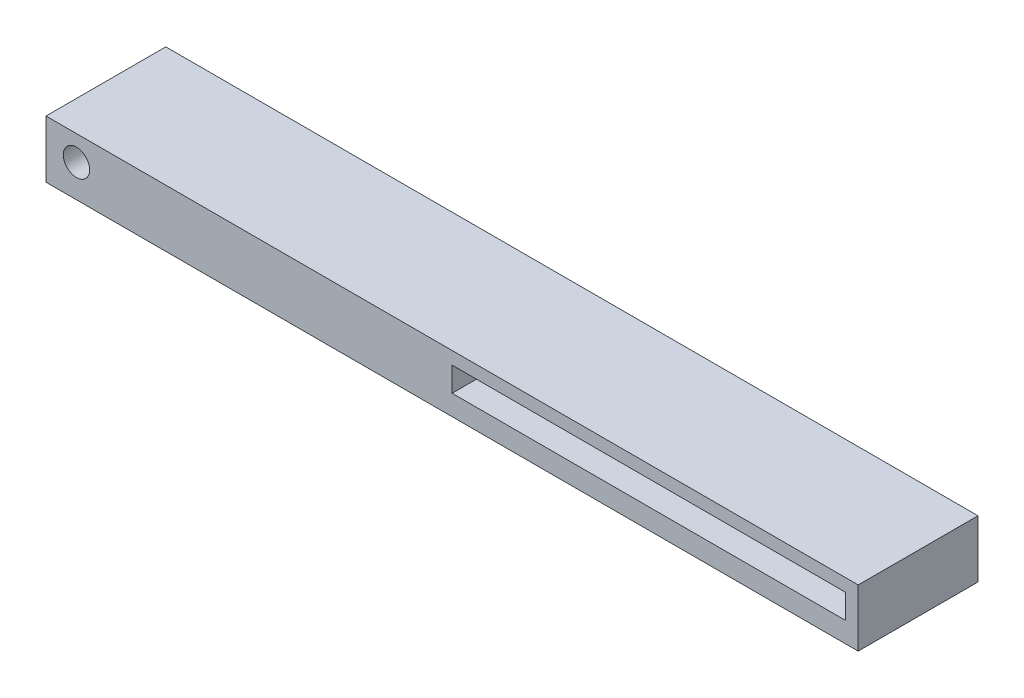
ISO-10303-21;
HEADER;
FILE_DESCRIPTION(('STEP AP214'),'2;1');
FILE_NAME('part.step','',(''),(''),'','','');
FILE_SCHEMA(('AUTOMOTIVE_DESIGN { 1 0 10303 214 1 1 1 1 }'));
ENDSEC;
DATA;
#1=APPLICATION_CONTEXT('core data for automotive mechanical design processes');
#2=APPLICATION_PROTOCOL_DEFINITION('international standard','automotive_design',2000,#1);
#3=PRODUCT_CONTEXT('',#1,'mechanical');
#4=PRODUCT('Part','Part','',(#3));
#5=PRODUCT_RELATED_PRODUCT_CATEGORY('part','',(#4));
#6=PRODUCT_DEFINITION_FORMATION('','',#4);
#7=PRODUCT_DEFINITION_CONTEXT('part definition',#1,'design');
#8=PRODUCT_DEFINITION('design','',#6,#7);
#9=PRODUCT_DEFINITION_SHAPE('','',#8);
#10=(LENGTH_UNIT() NAMED_UNIT(*) SI_UNIT(.MILLI.,.METRE.));
#11=(NAMED_UNIT(*) PLANE_ANGLE_UNIT() SI_UNIT($,.RADIAN.));
#12=(NAMED_UNIT(*) SI_UNIT($,.STERADIAN.) SOLID_ANGLE_UNIT());
#13=UNCERTAINTY_MEASURE_WITH_UNIT(LENGTH_MEASURE(1.E-05),#10,'distance_accuracy_value','');
#14=(GEOMETRIC_REPRESENTATION_CONTEXT(3) GLOBAL_UNCERTAINTY_ASSIGNED_CONTEXT((#13)) GLOBAL_UNIT_ASSIGNED_CONTEXT((#10,
#11,#12)) REPRESENTATION_CONTEXT('',''));
#15=CARTESIAN_POINT('',(0.,0.,0.));
#16=DIRECTION('',(0.,0.,1.));
#17=DIRECTION('',(1.,0.,0.));
#18=AXIS2_PLACEMENT_3D('',#15,#16,#17);
#19=CARTESIAN_POINT('',(68.0630963972736,7.1755,-2.54));
#20=DIRECTION('',(0.,1.,0.));
#21=DIRECTION('',(-1.,0.,0.));
#22=AXIS2_PLACEMENT_3D('',#19,#20,#21);
#23=PLANE('',#22);
#24=DIRECTION('',(0.,0.,1.));
#25=VECTOR('',#24,1.);
#26=CARTESIAN_POINT('',(68.0630963972736,7.1755,-2.54));
#27=LINE('',#26,#25);
#28=CARTESIAN_POINT('',(68.0630963972736,7.1755,0.254));
#29=VERTEX_POINT('',#28);
#30=CARTESIAN_POINT('',(68.0630963972736,7.1755,15.24));
#31=VERTEX_POINT('',#30);
#32=EDGE_CURVE('E47',#29,#31,#27,.T.);
#33=ORIENTED_EDGE('',*,*,#32,.F.);
#34=DIRECTION('',(1.,0.,0.));
#35=VECTOR('',#34,1.);
#36=CARTESIAN_POINT('',(-33.5369036027264,7.17549999999999,0.254));
#37=LINE('',#36,#35);
#38=CARTESIAN_POINT('',(-33.5369036027264,7.17549999999999,0.254));
#39=VERTEX_POINT('',#38);
#40=EDGE_CURVE('E110',#39,#29,#37,.T.);
#41=ORIENTED_EDGE('',*,*,#40,.F.);
#42=DIRECTION('',(0.,0.,1.));
#43=VECTOR('',#42,1.);
#44=CARTESIAN_POINT('',(-33.5369036027264,7.17549999999999,-2.54));
#45=LINE('',#44,#43);
#46=CARTESIAN_POINT('',(-33.5369036027264,7.17549999999999,15.24));
#47=VERTEX_POINT('',#46);
#48=EDGE_CURVE('E136',#39,#47,#45,.T.);
#49=ORIENTED_EDGE('',*,*,#48,.T.);
#50=DIRECTION('',(-1.,0.,0.));
#51=VECTOR('',#50,1.);
#52=CARTESIAN_POINT('',(68.0630963972736,7.1755,15.24));
#53=LINE('',#52,#51);
#54=EDGE_CURVE('E152',#31,#47,#53,.T.);
#55=ORIENTED_EDGE('',*,*,#54,.F.);
#56=EDGE_LOOP('',(#33,#41,#49,#55));
#57=FACE_BOUND('',#56,.T.);
#58=ADVANCED_FACE('F32',(#57),#23,.T.);
#59=CARTESIAN_POINT('',(66.4755963972736,5.588,-2.54));
#60=DIRECTION('',(-1.,0.,0.));
#61=DIRECTION('',(0.,0.,1.));
#62=AXIS2_PLACEMENT_3D('',#59,#60,#61);
#63=PLANE('',#62);
#64=DIRECTION('',(0.,0.,1.));
#65=VECTOR('',#64,1.);
#66=CARTESIAN_POINT('',(66.4755963972736,5.588,-2.54));
#67=LINE('',#66,#65);
#68=CARTESIAN_POINT('',(66.4755963972736,5.588,0.254));
#69=VERTEX_POINT('',#68);
#70=CARTESIAN_POINT('',(66.4755963972736,5.588,15.24));
#71=VERTEX_POINT('',#70);
#72=EDGE_CURVE('E55',#69,#71,#67,.T.);
#73=ORIENTED_EDGE('',*,*,#72,.F.);
#74=DIRECTION('',(0.,1.,0.));
#75=VECTOR('',#74,1.);
#76=CARTESIAN_POINT('',(66.4755963972736,2.54,0.254));
#77=LINE('',#76,#75);
#78=CARTESIAN_POINT('',(66.4755963972736,2.54,0.254));
#79=VERTEX_POINT('',#78);
#80=EDGE_CURVE('E174',#79,#69,#77,.T.);
#81=ORIENTED_EDGE('',*,*,#80,.F.);
#82=DIRECTION('',(0.,0.,1.));
#83=VECTOR('',#82,1.);
#84=CARTESIAN_POINT('',(66.4755963972736,2.54,-2.54));
#85=LINE('',#84,#83);
#86=CARTESIAN_POINT('',(66.4755963972736,2.54,15.24));
#87=VERTEX_POINT('',#86);
#88=EDGE_CURVE('E107',#79,#87,#85,.T.);
#89=ORIENTED_EDGE('',*,*,#88,.T.);
#90=DIRECTION('',(0.,-1.,0.));
#91=VECTOR('',#90,1.);
#92=CARTESIAN_POINT('',(66.4755963972736,5.588,15.24));
#93=LINE('',#92,#91);
#94=EDGE_CURVE('E128',#71,#87,#93,.T.);
#95=ORIENTED_EDGE('',*,*,#94,.F.);
#96=EDGE_LOOP('',(#73,#81,#89,#95));
#97=FACE_BOUND('',#96,.T.);
#98=ADVANCED_FACE('F173',(#97),#63,.T.);
#99=CARTESIAN_POINT('',(17.2630963972736,5.588,-2.54));
#100=DIRECTION('',(0.,-1.,0.));
#101=DIRECTION('',(0.,0.,-1.));
#102=AXIS2_PLACEMENT_3D('',#99,#100,#101);
#103=PLANE('',#102);
#104=DIRECTION('',(0.,0.,1.));
#105=VECTOR('',#104,1.);
#106=CARTESIAN_POINT('',(17.2630963972736,5.588,-2.54));
#107=LINE('',#106,#105);
#108=CARTESIAN_POINT('',(17.2630963972736,5.588,0.254));
#109=VERTEX_POINT('',#108);
#110=CARTESIAN_POINT('',(17.2630963972736,5.588,15.24));
#111=VERTEX_POINT('',#110);
#112=EDGE_CURVE('E124',#109,#111,#107,.T.);
#113=ORIENTED_EDGE('',*,*,#112,.F.);
#114=DIRECTION('',(-1.,0.,0.));
#115=VECTOR('',#114,1.);
#116=CARTESIAN_POINT('',(66.4755963972736,5.588,0.254));
#117=LINE('',#116,#115);
#118=EDGE_CURVE('E116',#69,#109,#117,.T.);
#119=ORIENTED_EDGE('',*,*,#118,.F.);
#120=ORIENTED_EDGE('',*,*,#72,.T.);
#121=DIRECTION('',(1.,0.,0.));
#122=VECTOR('',#121,1.);
#123=CARTESIAN_POINT('',(17.2630963972736,5.588,15.24));
#124=LINE('',#123,#122);
#125=EDGE_CURVE('E165',#111,#71,#124,.T.);
#126=ORIENTED_EDGE('',*,*,#125,.F.);
#127=EDGE_LOOP('',(#113,#119,#120,#126));
#128=FACE_BOUND('',#127,.T.);
#129=ADVANCED_FACE('F175',(#128),#103,.T.);
#130=CARTESIAN_POINT('',(17.2630963972736,2.54,-2.54));
#131=DIRECTION('',(1.,0.,0.));
#132=DIRECTION('',(0.,0.,-1.));
#133=AXIS2_PLACEMENT_3D('',#130,#131,#132);
#134=PLANE('',#133);
#135=DIRECTION('',(0.,0.,1.));
#136=VECTOR('',#135,1.);
#137=CARTESIAN_POINT('',(17.2630963972736,2.54,-2.54));
#138=LINE('',#137,#136);
#139=CARTESIAN_POINT('',(17.2630963972736,2.54,0.254));
#140=VERTEX_POINT('',#139);
#141=CARTESIAN_POINT('',(17.2630963972736,2.54,15.24));
#142=VERTEX_POINT('',#141);
#143=EDGE_CURVE('E104',#140,#142,#138,.T.);
#144=ORIENTED_EDGE('',*,*,#143,.F.);
#145=DIRECTION('',(0.,-1.,0.));
#146=VECTOR('',#145,1.);
#147=CARTESIAN_POINT('',(17.2630963972736,5.588,0.254));
#148=LINE('',#147,#146);
#149=EDGE_CURVE('E114',#109,#140,#148,.T.);
#150=ORIENTED_EDGE('',*,*,#149,.F.);
#151=ORIENTED_EDGE('',*,*,#112,.T.);
#152=DIRECTION('',(0.,1.,0.));
#153=VECTOR('',#152,1.);
#154=CARTESIAN_POINT('',(17.2630963972736,2.54,15.24));
#155=LINE('',#154,#153);
#156=EDGE_CURVE('E123',#142,#111,#155,.T.);
#157=ORIENTED_EDGE('',*,*,#156,.F.);
#158=EDGE_LOOP('',(#144,#150,#151,#157));
#159=FACE_BOUND('',#158,.T.);
#160=ADVANCED_FACE('F121',(#159),#134,.T.);
#161=CARTESIAN_POINT('',(0.,2.54,0.));
#162=DIRECTION('',(0.,1.,0.));
#163=DIRECTION('',(0.,0.,1.));
#164=AXIS2_PLACEMENT_3D('',#161,#162,#163);
#165=PLANE('',#164);
#166=DIRECTION('',(1.,0.,0.));
#167=VECTOR('',#166,1.);
#168=CARTESIAN_POINT('',(-33.5369036027264,2.54,0.254));
#169=LINE('',#168,#167);
#170=EDGE_CURVE('E100',#140,#79,#169,.T.);
#171=ORIENTED_EDGE('',*,*,#170,.F.);
#172=ORIENTED_EDGE('',*,*,#143,.T.);
#173=DIRECTION('',(-1.,0.,0.));
#174=VECTOR('',#173,1.);
#175=CARTESIAN_POINT('',(68.0630963972736,2.54,15.24));
#176=LINE('',#175,#174);
#177=EDGE_CURVE('E111',#87,#142,#176,.T.);
#178=ORIENTED_EDGE('',*,*,#177,.F.);
#179=ORIENTED_EDGE('',*,*,#88,.F.);
#180=EDGE_LOOP('',(#171,#172,#178,#179));
#181=FACE_BOUND('',#180,.T.);
#182=ADVANCED_FACE('F102',(#181),#165,.T.);
#183=CARTESIAN_POINT('',(-33.5369036027264,2.54,-4.88461538461538));
#184=DIRECTION('',(1.,0.,0.));
#185=DIRECTION('',(0.,0.,-1.));
#186=AXIS2_PLACEMENT_3D('',#183,#184,#185);
#187=PLANE('',#186);
#188=DIRECTION('',(0.,1.,0.));
#189=VECTOR('',#188,1.);
#190=CARTESIAN_POINT('',(-33.5369036027264,2.54,0.254));
#191=LINE('',#190,#189);
#192=CARTESIAN_POINT('',(-33.5369036027264,0.,0.254));
#193=VERTEX_POINT('',#192);
#194=EDGE_CURVE('E119',#193,#39,#191,.T.);
#195=ORIENTED_EDGE('',*,*,#194,.F.);
#196=DIRECTION('',(0.,0.,1.));
#197=VECTOR('',#196,1.);
#198=CARTESIAN_POINT('',(-33.5369036027264,0.,-4.88461538461538));
#199=LINE('',#198,#197);
#200=CARTESIAN_POINT('',(-33.5369036027264,0.,15.24));
#201=VERTEX_POINT('',#200);
#202=EDGE_CURVE('E132',#193,#201,#199,.T.);
#203=ORIENTED_EDGE('',*,*,#202,.T.);
#204=DIRECTION('',(0.,-1.,0.));
#205=VECTOR('',#204,1.);
#206=CARTESIAN_POINT('',(-33.5369036027264,7.17549999999999,15.24));
#207=LINE('',#206,#205);
#208=EDGE_CURVE('E148',#47,#201,#207,.T.);
#209=ORIENTED_EDGE('',*,*,#208,.F.);
#210=ORIENTED_EDGE('',*,*,#48,.F.);
#211=EDGE_LOOP('',(#195,#203,#209,#210));
#212=FACE_BOUND('',#211,.T.);
#213=ADVANCED_FACE('F34',(#212),#187,.F.);
#214=CARTESIAN_POINT('',(68.0630963972736,2.54,-4.88461538461538));
#215=DIRECTION('',(-1.,0.,0.));
#216=DIRECTION('',(0.,0.,1.));
#217=AXIS2_PLACEMENT_3D('',#214,#215,#216);
#218=PLANE('',#217);
#219=DIRECTION('',(0.,0.,-1.));
#220=VECTOR('',#219,1.);
#221=CARTESIAN_POINT('',(68.0630963972736,0.,-4.88461538461538));
#222=LINE('',#221,#220);
#223=CARTESIAN_POINT('',(68.0630963972736,0.,15.24));
#224=VERTEX_POINT('',#223);
#225=CARTESIAN_POINT('',(68.0630963972736,0.,0.254));
#226=VERTEX_POINT('',#225);
#227=EDGE_CURVE('E135',#224,#226,#222,.T.);
#228=ORIENTED_EDGE('',*,*,#227,.T.);
#229=DIRECTION('',(0.,-1.,0.));
#230=VECTOR('',#229,1.);
#231=CARTESIAN_POINT('',(68.0630963972736,7.1755,0.254));
#232=LINE('',#231,#230);
#233=EDGE_CURVE('E154',#29,#226,#232,.T.);
#234=ORIENTED_EDGE('',*,*,#233,.F.);
#235=ORIENTED_EDGE('',*,*,#32,.T.);
#236=DIRECTION('',(0.,1.,0.));
#237=VECTOR('',#236,1.);
#238=CARTESIAN_POINT('',(68.0630963972736,2.54,15.24));
#239=LINE('',#238,#237);
#240=EDGE_CURVE('E125',#224,#31,#239,.T.);
#241=ORIENTED_EDGE('',*,*,#240,.F.);
#242=EDGE_LOOP('',(#228,#234,#235,#241));
#243=FACE_BOUND('',#242,.T.);
#244=ADVANCED_FACE('F155',(#243),#218,.F.);
#245=CARTESIAN_POINT('',(0.,0.,0.));
#246=DIRECTION('',(0.,1.,0.));
#247=DIRECTION('',(0.,0.,1.));
#248=AXIS2_PLACEMENT_3D('',#245,#246,#247);
#249=PLANE('',#248);
#250=ORIENTED_EDGE('',*,*,#202,.F.);
#251=DIRECTION('',(1.,0.,0.));
#252=VECTOR('',#251,1.);
#253=CARTESIAN_POINT('',(0.,0.,0.254));
#254=LINE('',#253,#252);
#255=EDGE_CURVE('E11',#193,#226,#254,.T.);
#256=ORIENTED_EDGE('',*,*,#255,.T.);
#257=ORIENTED_EDGE('',*,*,#227,.F.);
#258=DIRECTION('',(-1.,0.,0.));
#259=VECTOR('',#258,1.);
#260=CARTESIAN_POINT('',(0.,0.,15.24));
#261=LINE('',#260,#259);
#262=EDGE_CURVE('E40',#224,#201,#261,.T.);
#263=ORIENTED_EDGE('',*,*,#262,.T.);
#264=EDGE_LOOP('',(#250,#256,#257,#263));
#265=FACE_BOUND('',#264,.T.);
#266=ADVANCED_FACE('F143',(#265),#249,.F.);
#267=CARTESIAN_POINT('',(0.,0.,15.24));
#268=DIRECTION('',(0.,0.,1.));
#269=DIRECTION('',(1.,0.,0.));
#270=AXIS2_PLACEMENT_3D('',#267,#268,#269);
#271=PLANE('',#270);
#272=CARTESIAN_POINT('',(-29.7269036027264,4.064,15.24));
#273=DIRECTION('',(0.,0.,1.));
#274=DIRECTION('',(1.,0.,0.));
#275=AXIS2_PLACEMENT_3D('',#272,#273,#274);
#276=CIRCLE('',#275,1.651);
#277=CARTESIAN_POINT('',(-28.0759036027264,4.064,15.24));
#278=VERTEX_POINT('',#277);
#279=EDGE_CURVE('E183',#278,#278,#276,.T.);
#280=ORIENTED_EDGE('',*,*,#279,.F.);
#281=EDGE_LOOP('',(#280));
#282=FACE_BOUND('',#281,.T.);
#283=ORIENTED_EDGE('',*,*,#262,.F.);
#284=ORIENTED_EDGE('',*,*,#240,.T.);
#285=ORIENTED_EDGE('',*,*,#54,.T.);
#286=ORIENTED_EDGE('',*,*,#208,.T.);
#287=EDGE_LOOP('',(#283,#284,#285,#286));
#288=FACE_BOUND('',#287,.T.);
#289=ORIENTED_EDGE('',*,*,#94,.T.);
#290=ORIENTED_EDGE('',*,*,#177,.T.);
#291=ORIENTED_EDGE('',*,*,#156,.T.);
#292=ORIENTED_EDGE('',*,*,#125,.T.);
#293=EDGE_LOOP('',(#289,#290,#291,#292));
#294=FACE_BOUND('',#293,.T.);
#295=ADVANCED_FACE('F158',(#282,#288,#294),#271,.T.);
#296=CARTESIAN_POINT('',(0.,0.,0.254));
#297=DIRECTION('',(0.,0.,-1.));
#298=DIRECTION('',(-1.,0.,0.));
#299=AXIS2_PLACEMENT_3D('',#296,#297,#298);
#300=PLANE('',#299);
#301=CARTESIAN_POINT('',(-29.7269036027264,4.064,0.253999999999999));
#302=DIRECTION('',(0.,0.,1.));
#303=DIRECTION('',(1.,0.,0.));
#304=AXIS2_PLACEMENT_3D('',#301,#302,#303);
#305=CIRCLE('',#304,1.651);
#306=CARTESIAN_POINT('',(-28.0759036027264,4.064,0.253999999999999));
#307=VERTEX_POINT('',#306);
#308=EDGE_CURVE('E181',#307,#307,#305,.T.);
#309=ORIENTED_EDGE('',*,*,#308,.T.);
#310=EDGE_LOOP('',(#309));
#311=FACE_BOUND('',#310,.T.);
#312=ORIENTED_EDGE('',*,*,#255,.F.);
#313=ORIENTED_EDGE('',*,*,#194,.T.);
#314=ORIENTED_EDGE('',*,*,#40,.T.);
#315=ORIENTED_EDGE('',*,*,#233,.T.);
#316=EDGE_LOOP('',(#312,#313,#314,#315));
#317=FACE_BOUND('',#316,.T.);
#318=ORIENTED_EDGE('',*,*,#149,.T.);
#319=ORIENTED_EDGE('',*,*,#170,.T.);
#320=ORIENTED_EDGE('',*,*,#80,.T.);
#321=ORIENTED_EDGE('',*,*,#118,.T.);
#322=EDGE_LOOP('',(#318,#319,#320,#321));
#323=FACE_BOUND('',#322,.T.);
#324=ADVANCED_FACE('F115',(#311,#317,#323),#300,.T.);
#325=CARTESIAN_POINT('',(-29.7269036027264,4.064,0.253999999999999));
#326=DIRECTION('',(0.,0.,1.));
#327=DIRECTION('',(1.,0.,0.));
#328=AXIS2_PLACEMENT_3D('',#325,#326,#327);
#329=CYLINDRICAL_SURFACE('',#328,1.651);
#330=ORIENTED_EDGE('',*,*,#308,.F.);
#331=EDGE_LOOP('',(#330));
#332=FACE_BOUND('',#331,.T.);
#333=ORIENTED_EDGE('',*,*,#279,.T.);
#334=EDGE_LOOP('',(#333));
#335=FACE_BOUND('',#334,.T.);
#336=ADVANCED_FACE('F190',(#332,#335),#329,.F.);
#337=CLOSED_SHELL('',(#58,#98,#129,#160,#182,#213,#244,#266,#295,#324,#336));
#338=MANIFOLD_SOLID_BREP('B2',#337);
#339=ADVANCED_BREP_SHAPE_REPRESENTATION('',(#18,#338),#14);
#340=SHAPE_DEFINITION_REPRESENTATION(#9,#339);
ENDSEC;
END-ISO-10303-21;
